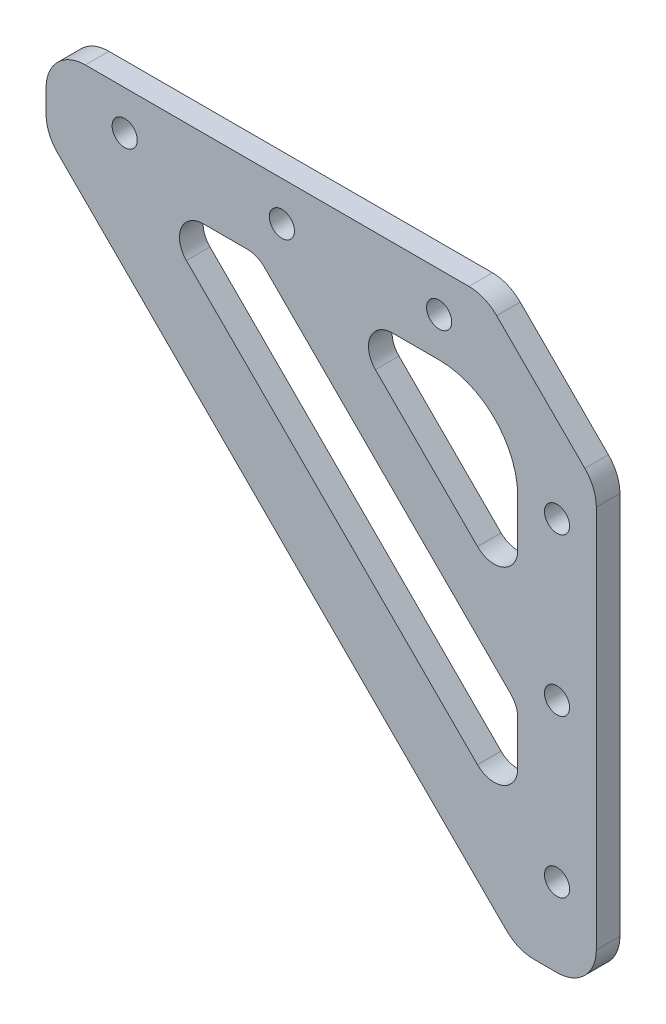
ISO-10303-21;
HEADER;
FILE_DESCRIPTION(('STEP AP214'),'2;1');
FILE_NAME('part.step','',(''),(''),'','','');
FILE_SCHEMA(('AUTOMOTIVE_DESIGN { 1 0 10303 214 1 1 1 1 }'));
ENDSEC;
DATA;
#1=APPLICATION_CONTEXT('core data for automotive mechanical design processes');
#2=APPLICATION_PROTOCOL_DEFINITION('international standard','automotive_design',2000,#1);
#3=PRODUCT_CONTEXT('',#1,'mechanical');
#4=PRODUCT('Part','Part','',(#3));
#5=PRODUCT_RELATED_PRODUCT_CATEGORY('part','',(#4));
#6=PRODUCT_DEFINITION_FORMATION('','',#4);
#7=PRODUCT_DEFINITION_CONTEXT('part definition',#1,'design');
#8=PRODUCT_DEFINITION('design','',#6,#7);
#9=PRODUCT_DEFINITION_SHAPE('','',#8);
#10=(LENGTH_UNIT() NAMED_UNIT(*) SI_UNIT(.MILLI.,.METRE.));
#11=(NAMED_UNIT(*) PLANE_ANGLE_UNIT() SI_UNIT($,.RADIAN.));
#12=(NAMED_UNIT(*) SI_UNIT($,.STERADIAN.) SOLID_ANGLE_UNIT());
#13=UNCERTAINTY_MEASURE_WITH_UNIT(LENGTH_MEASURE(1.E-05),#10,'distance_accuracy_value','');
#14=(GEOMETRIC_REPRESENTATION_CONTEXT(3) GLOBAL_UNCERTAINTY_ASSIGNED_CONTEXT((#13)) GLOBAL_UNIT_ASSIGNED_CONTEXT((#10,
#11,#12)) REPRESENTATION_CONTEXT('',''));
#15=CARTESIAN_POINT('',(0.,0.,0.));
#16=DIRECTION('',(0.,0.,1.));
#17=DIRECTION('',(1.,0.,0.));
#18=AXIS2_PLACEMENT_3D('',#15,#16,#17);
#19=CARTESIAN_POINT('',(-70.,-10.,3.));
#20=DIRECTION('',(0.,1.,0.));
#21=DIRECTION('',(-1.,0.,0.));
#22=AXIS2_PLACEMENT_3D('',#19,#20,#21);
#23=PLANE('',#22);
#24=DIRECTION('',(1.,0.,0.));
#25=VECTOR('',#24,1.);
#26=CARTESIAN_POINT('',(-70.,-10.,0.));
#27=LINE('',#26,#25);
#28=CARTESIAN_POINT('',(-25.9878066911802,-10.,0.));
#29=VERTEX_POINT('',#28);
#30=CARTESIAN_POINT('',(-20.,-10.,0.));
#31=VERTEX_POINT('',#30);
#32=EDGE_CURVE('E461',#29,#31,#27,.T.);
#33=ORIENTED_EDGE('',*,*,#32,.T.);
#34=DIRECTION('',(0.,0.,-1.));
#35=VECTOR('',#34,1.);
#36=CARTESIAN_POINT('',(-20.,-10.,3.));
#37=LINE('',#36,#35);
#38=CARTESIAN_POINT('',(-20.,-10.,3.));
#39=VERTEX_POINT('',#38);
#40=EDGE_CURVE('E64',#31,#39,#37,.F.);
#41=ORIENTED_EDGE('',*,*,#40,.T.);
#42=DIRECTION('',(1.,0.,0.));
#43=VECTOR('',#42,1.);
#44=CARTESIAN_POINT('',(-70.,-10.,3.));
#45=LINE('',#44,#43);
#46=CARTESIAN_POINT('',(-25.9878066911802,-10.,3.));
#47=VERTEX_POINT('',#46);
#48=EDGE_CURVE('E448',#47,#39,#45,.T.);
#49=ORIENTED_EDGE('',*,*,#48,.F.);
#50=DIRECTION('',(0.,0.,1.));
#51=VECTOR('',#50,1.);
#52=CARTESIAN_POINT('',(-25.9878066911802,-10.,3.));
#53=LINE('',#52,#51);
#54=EDGE_CURVE('E319',#47,#29,#53,.F.);
#55=ORIENTED_EDGE('',*,*,#54,.T.);
#56=EDGE_LOOP('',(#33,#41,#49,#55));
#57=FACE_BOUND('',#56,.T.);
#58=ADVANCED_FACE('F43',(#57),#23,.F.);
#59=CARTESIAN_POINT('',(-9.99999999999999,-70.,3.));
#60=DIRECTION('',(1.,0.,0.));
#61=DIRECTION('',(0.,1.,0.));
#62=AXIS2_PLACEMENT_3D('',#59,#60,#61);
#63=PLANE('',#62);
#64=DIRECTION('',(0.,-1.,0.));
#65=VECTOR('',#64,1.);
#66=CARTESIAN_POINT('',(-9.99999999999999,-70.,3.));
#67=LINE('',#66,#65);
#68=CARTESIAN_POINT('',(-9.99999999999999,-20.,3.));
#69=VERTEX_POINT('',#68);
#70=CARTESIAN_POINT('',(-9.99999999999999,-25.9878066911802,3.));
#71=VERTEX_POINT('',#70);
#72=EDGE_CURVE('E358',#69,#71,#67,.T.);
#73=ORIENTED_EDGE('',*,*,#72,.F.);
#74=DIRECTION('',(0.,0.,-1.));
#75=VECTOR('',#74,1.);
#76=CARTESIAN_POINT('',(-9.99999999999999,-20.,0.));
#77=LINE('',#76,#75);
#78=CARTESIAN_POINT('',(-9.99999999999999,-20.,0.));
#79=VERTEX_POINT('',#78);
#80=EDGE_CURVE('E351',#69,#79,#77,.T.);
#81=ORIENTED_EDGE('',*,*,#80,.T.);
#82=DIRECTION('',(0.,-1.,0.));
#83=VECTOR('',#82,1.);
#84=CARTESIAN_POINT('',(-9.99999999999999,-70.,0.));
#85=LINE('',#84,#83);
#86=CARTESIAN_POINT('',(-9.99999999999999,-25.9878066911802,0.));
#87=VERTEX_POINT('',#86);
#88=EDGE_CURVE('E243',#79,#87,#85,.T.);
#89=ORIENTED_EDGE('',*,*,#88,.T.);
#90=DIRECTION('',(0.,0.,1.));
#91=VECTOR('',#90,1.);
#92=CARTESIAN_POINT('',(-9.99999999999999,-25.9878066911802,3.));
#93=LINE('',#92,#91);
#94=EDGE_CURVE('E311',#87,#71,#93,.T.);
#95=ORIENTED_EDGE('',*,*,#94,.T.);
#96=EDGE_LOOP('',(#73,#81,#89,#95));
#97=FACE_BOUND('',#96,.T.);
#98=ADVANCED_FACE('F357',(#97),#63,.F.);
#99=CARTESIAN_POINT('',(0.,0.,3.));
#100=DIRECTION('',(-1.,0.,0.));
#101=DIRECTION('',(0.,-1.,0.));
#102=AXIS2_PLACEMENT_3D('',#99,#100,#101);
#103=PLANE('',#102);
#104=DIRECTION('',(0.,1.,0.));
#105=VECTOR('',#104,1.);
#106=CARTESIAN_POINT('',(0.,0.,3.));
#107=LINE('',#106,#105);
#108=CARTESIAN_POINT('',(0.,-65.,3.));
#109=VERTEX_POINT('',#108);
#110=CARTESIAN_POINT('',(0.,-16.2132034355964,3.));
#111=VERTEX_POINT('',#110);
#112=EDGE_CURVE('E242',#109,#111,#107,.T.);
#113=ORIENTED_EDGE('',*,*,#112,.F.);
#114=DIRECTION('',(0.,0.,-1.));
#115=VECTOR('',#114,1.);
#116=CARTESIAN_POINT('',(0.,-65.,3.));
#117=LINE('',#116,#115);
#118=CARTESIAN_POINT('',(0.,-65.,0.));
#119=VERTEX_POINT('',#118);
#120=EDGE_CURVE('E278',#109,#119,#117,.T.);
#121=ORIENTED_EDGE('',*,*,#120,.T.);
#122=DIRECTION('',(0.,1.,0.));
#123=VECTOR('',#122,1.);
#124=CARTESIAN_POINT('',(0.,0.,0.));
#125=LINE('',#124,#123);
#126=CARTESIAN_POINT('',(0.,-16.2132034355964,0.));
#127=VERTEX_POINT('',#126);
#128=EDGE_CURVE('E440',#119,#127,#125,.T.);
#129=ORIENTED_EDGE('',*,*,#128,.T.);
#130=DIRECTION('',(0.,0.,-1.));
#131=VECTOR('',#130,1.);
#132=CARTESIAN_POINT('',(0.,-16.2132034355964,3.));
#133=LINE('',#132,#131);
#134=EDGE_CURVE('E276',#127,#111,#133,.F.);
#135=ORIENTED_EDGE('',*,*,#134,.T.);
#136=EDGE_LOOP('',(#113,#121,#129,#135));
#137=FACE_BOUND('',#136,.T.);
#138=ADVANCED_FACE('F516',(#137),#103,.F.);
#139=CARTESIAN_POINT('',(0.,0.,3.));
#140=DIRECTION('',(0.,0.,-1.));
#141=DIRECTION('',(-1.,0.,0.));
#142=AXIS2_PLACEMENT_3D('',#139,#140,#141);
#143=PLANE('',#142);
#144=DIRECTION('',(-0.707106781186548,0.707106781186547,0.));
#145=VECTOR('',#144,1.);
#146=CARTESIAN_POINT('',(-9.99999999999999,-57.2720779386421,3.));
#147=LINE('',#146,#145);
#148=CARTESIAN_POINT('',(-15.1213203435596,-52.1507575950825,3.));
#149=VERTEX_POINT('',#148);
#150=CARTESIAN_POINT('',(-52.1507575950825,-15.1213203435596,3.));
#151=VERTEX_POINT('',#150);
#152=EDGE_CURVE('E399',#149,#151,#147,.T.);
#153=ORIENTED_EDGE('',*,*,#152,.T.);
#154=CARTESIAN_POINT('',(-50.0294372515229,-13.,3.));
#155=DIRECTION('',(0.,0.,-1.));
#156=DIRECTION('',(-1.,0.,0.));
#157=AXIS2_PLACEMENT_3D('',#154,#155,#156);
#158=CIRCLE('',#157,3.);
#159=CARTESIAN_POINT('',(-50.0294372515229,-10.,3.));
#160=VERTEX_POINT('',#159);
#161=EDGE_CURVE('E347',#151,#160,#158,.T.);
#162=ORIENTED_EDGE('',*,*,#161,.T.);
#163=CARTESIAN_POINT('',(-44.3725830020305,-10.,3.));
#164=VERTEX_POINT('',#163);
#165=EDGE_CURVE('E450',#160,#164,#45,.T.);
#166=ORIENTED_EDGE('',*,*,#165,.T.);
#167=CARTESIAN_POINT('',(-44.3725830020305,-13.,3.));
#168=DIRECTION('',(0.,0.,-1.));
#169=DIRECTION('',(-1.,0.,0.));
#170=AXIS2_PLACEMENT_3D('',#167,#168,#169);
#171=CIRCLE('',#170,3.);
#172=CARTESIAN_POINT('',(-42.2512626584708,-10.8786796564404,3.));
#173=VERTEX_POINT('',#172);
#174=EDGE_CURVE('E330',#164,#173,#171,.T.);
#175=ORIENTED_EDGE('',*,*,#174,.T.);
#176=DIRECTION('',(0.707106781186548,-0.707106781186548,0.));
#177=VECTOR('',#176,1.);
#178=CARTESIAN_POINT('',(-43.1299423149112,-10.,3.));
#179=LINE('',#178,#177);
#180=CARTESIAN_POINT('',(-10.8786796564403,-42.2512626584708,3.));
#181=VERTEX_POINT('',#180);
#182=EDGE_CURVE('E381',#173,#181,#179,.T.);
#183=ORIENTED_EDGE('',*,*,#182,.T.);
#184=CARTESIAN_POINT('',(-13.,-44.3725830020305,3.));
#185=DIRECTION('',(0.,0.,-1.));
#186=DIRECTION('',(-1.,0.,0.));
#187=AXIS2_PLACEMENT_3D('',#184,#185,#186);
#188=CIRCLE('',#187,3.);
#189=CARTESIAN_POINT('',(-9.99999999999999,-44.3725830020305,3.));
#190=VERTEX_POINT('',#189);
#191=EDGE_CURVE('E326',#181,#190,#188,.T.);
#192=ORIENTED_EDGE('',*,*,#191,.T.);
#193=CARTESIAN_POINT('',(-9.99999999999999,-50.0294372515229,3.));
#194=VERTEX_POINT('',#193);
#195=EDGE_CURVE('E452',#190,#194,#67,.T.);
#196=ORIENTED_EDGE('',*,*,#195,.T.);
#197=CARTESIAN_POINT('',(-13.,-50.0294372515229,3.));
#198=DIRECTION('',(0.,0.,-1.));
#199=DIRECTION('',(-1.,0.,0.));
#200=AXIS2_PLACEMENT_3D('',#197,#198,#199);
#201=CIRCLE('',#200,3.);
#202=EDGE_CURVE('E343',#194,#149,#201,.T.);
#203=ORIENTED_EDGE('',*,*,#202,.T.);
#204=EDGE_LOOP('',(#153,#162,#166,#175,#183,#192,#196,#203));
#205=FACE_BOUND('',#204,.T.);
#206=ORIENTED_EDGE('',*,*,#48,.T.);
#207=CARTESIAN_POINT('',(-20.,-20.,3.));
#208=DIRECTION('',(0.,0.,-1.));
#209=DIRECTION('',(-1.,0.,0.));
#210=AXIS2_PLACEMENT_3D('',#207,#208,#209);
#211=CIRCLE('',#210,10.);
#212=EDGE_CURVE('E11',#39,#69,#211,.T.);
#213=ORIENTED_EDGE('',*,*,#212,.T.);
#214=ORIENTED_EDGE('',*,*,#72,.T.);
#215=CARTESIAN_POINT('',(-13.,-25.9878066911802,3.));
#216=DIRECTION('',(0.,0.,-1.));
#217=DIRECTION('',(-1.,0.,0.));
#218=AXIS2_PLACEMENT_3D('',#215,#216,#217);
#219=CIRCLE('',#218,3.);
#220=CARTESIAN_POINT('',(-15.1213203435596,-28.1091270347399,3.));
#221=VERTEX_POINT('',#220);
#222=EDGE_CURVE('E334',#71,#221,#219,.T.);
#223=ORIENTED_EDGE('',*,*,#222,.T.);
#224=DIRECTION('',(-0.707106781186548,0.707106781186548,0.));
#225=VECTOR('',#224,1.);
#226=CARTESIAN_POINT('',(-9.99999999999999,-33.2304473782995,3.));
#227=LINE('',#226,#225);
#228=CARTESIAN_POINT('',(-28.1091270347399,-15.1213203435596,3.));
#229=VERTEX_POINT('',#228);
#230=EDGE_CURVE('E376',#221,#229,#227,.T.);
#231=ORIENTED_EDGE('',*,*,#230,.T.);
#232=CARTESIAN_POINT('',(-25.9878066911802,-13.,3.));
#233=DIRECTION('',(0.,0.,-1.));
#234=DIRECTION('',(-1.,0.,0.));
#235=AXIS2_PLACEMENT_3D('',#232,#233,#234);
#236=CIRCLE('',#235,3.);
#237=EDGE_CURVE('E339',#229,#47,#236,.T.);
#238=ORIENTED_EDGE('',*,*,#237,.T.);
#239=EDGE_LOOP('',(#206,#213,#214,#223,#231,#238));
#240=FACE_BOUND('',#239,.T.);
#241=DIRECTION('',(0.707106781186548,-0.707106781186547,0.));
#242=VECTOR('',#241,1.);
#243=CARTESIAN_POINT('',(-70.,-10.,3.));
#244=LINE('',#243,#242);
#245=CARTESIAN_POINT('',(-68.5355339059327,-11.4644660940673,3.));
#246=VERTEX_POINT('',#245);
#247=CARTESIAN_POINT('',(-11.4644660940673,-68.5355339059327,3.));
#248=VERTEX_POINT('',#247);
#249=EDGE_CURVE('E392',#246,#248,#244,.T.);
#250=ORIENTED_EDGE('',*,*,#249,.T.);
#251=CARTESIAN_POINT('',(-7.92893218813453,-65.,3.));
#252=DIRECTION('',(0.,0.,-1.));
#253=DIRECTION('',(-1.,0.,0.));
#254=AXIS2_PLACEMENT_3D('',#251,#252,#253);
#255=CIRCLE('',#254,5.);
#256=CARTESIAN_POINT('',(-7.92893218813452,-70.,3.));
#257=VERTEX_POINT('',#256);
#258=EDGE_CURVE('E274',#248,#257,#255,.F.);
#259=ORIENTED_EDGE('',*,*,#258,.T.);
#260=DIRECTION('',(1.,0.,0.));
#261=VECTOR('',#260,1.);
#262=CARTESIAN_POINT('',(0.,-70.,3.));
#263=LINE('',#262,#261);
#264=CARTESIAN_POINT('',(-4.99999999999995,-70.,3.));
#265=VERTEX_POINT('',#264);
#266=EDGE_CURVE('E236',#257,#265,#263,.T.);
#267=ORIENTED_EDGE('',*,*,#266,.T.);
#268=CARTESIAN_POINT('',(-4.99999999999996,-65.,3.));
#269=DIRECTION('',(0.,0.,-1.));
#270=DIRECTION('',(-1.,0.,0.));
#271=AXIS2_PLACEMENT_3D('',#268,#269,#270);
#272=CIRCLE('',#271,5.);
#273=EDGE_CURVE('E272',#265,#109,#272,.F.);
#274=ORIENTED_EDGE('',*,*,#273,.T.);
#275=ORIENTED_EDGE('',*,*,#112,.T.);
#276=CARTESIAN_POINT('',(-4.99999999999999,-16.2132034355964,3.));
#277=DIRECTION('',(0.,0.,-1.));
#278=DIRECTION('',(-1.,0.,0.));
#279=AXIS2_PLACEMENT_3D('',#276,#277,#278);
#280=CIRCLE('',#279,5.);
#281=CARTESIAN_POINT('',(-1.46446609406726,-12.6776695296637,3.));
#282=VERTEX_POINT('',#281);
#283=EDGE_CURVE('E266',#111,#282,#280,.F.);
#284=ORIENTED_EDGE('',*,*,#283,.T.);
#285=DIRECTION('',(-0.707106781186548,0.707106781186547,0.));
#286=VECTOR('',#285,1.);
#287=CARTESIAN_POINT('',(-14.142135623731,0.,3.));
#288=LINE('',#287,#286);
#289=CARTESIAN_POINT('',(-12.6776695296637,-1.46446609406725,3.));
#290=VERTEX_POINT('',#289);
#291=EDGE_CURVE('E393',#282,#290,#288,.T.);
#292=ORIENTED_EDGE('',*,*,#291,.T.);
#293=CARTESIAN_POINT('',(-16.2132034355964,-4.99999999999999,3.));
#294=DIRECTION('',(0.,0.,-1.));
#295=DIRECTION('',(-1.,0.,0.));
#296=AXIS2_PLACEMENT_3D('',#293,#294,#295);
#297=CIRCLE('',#296,5.);
#298=CARTESIAN_POINT('',(-16.2132034355964,0.,3.));
#299=VERTEX_POINT('',#298);
#300=EDGE_CURVE('E264',#290,#299,#297,.F.);
#301=ORIENTED_EDGE('',*,*,#300,.T.);
#302=DIRECTION('',(-1.,0.,0.));
#303=VECTOR('',#302,1.);
#304=CARTESIAN_POINT('',(0.,0.,3.));
#305=LINE('',#304,#303);
#306=CARTESIAN_POINT('',(-65.,0.,3.));
#307=VERTEX_POINT('',#306);
#308=EDGE_CURVE('E246',#299,#307,#305,.T.);
#309=ORIENTED_EDGE('',*,*,#308,.T.);
#310=CARTESIAN_POINT('',(-65.,-4.99999999999997,3.));
#311=DIRECTION('',(0.,0.,-1.));
#312=DIRECTION('',(-1.,0.,0.));
#313=AXIS2_PLACEMENT_3D('',#310,#311,#312);
#314=CIRCLE('',#313,5.);
#315=CARTESIAN_POINT('',(-70.,-4.99999999999997,3.));
#316=VERTEX_POINT('',#315);
#317=EDGE_CURVE('E268',#307,#316,#314,.F.);
#318=ORIENTED_EDGE('',*,*,#317,.T.);
#319=DIRECTION('',(0.,-1.,0.));
#320=VECTOR('',#319,1.);
#321=CARTESIAN_POINT('',(-70.,0.,3.));
#322=LINE('',#321,#320);
#323=CARTESIAN_POINT('',(-70.,-7.92893218813453,3.));
#324=VERTEX_POINT('',#323);
#325=EDGE_CURVE('E445',#316,#324,#322,.T.);
#326=ORIENTED_EDGE('',*,*,#325,.T.);
#327=CARTESIAN_POINT('',(-65.,-7.92893218813453,3.));
#328=DIRECTION('',(0.,0.,-1.));
#329=DIRECTION('',(-1.,0.,0.));
#330=AXIS2_PLACEMENT_3D('',#327,#328,#329);
#331=CIRCLE('',#330,5.);
#332=EDGE_CURVE('E270',#324,#246,#331,.F.);
#333=ORIENTED_EDGE('',*,*,#332,.T.);
#334=EDGE_LOOP('',(#250,#259,#267,#274,#275,#284,#292,#301,#309,#318,#326,#333));
#335=FACE_BOUND('',#334,.T.);
#336=CARTESIAN_POINT('',(-40.,-5.00000000000001,3.));
#337=DIRECTION('',(0.,0.,1.));
#338=DIRECTION('',(1.,0.,0.));
#339=AXIS2_PLACEMENT_3D('',#336,#337,#338);
#340=CIRCLE('',#339,1.6);
#341=CARTESIAN_POINT('',(-38.4,-5.00000000000001,3.));
#342=VERTEX_POINT('',#341);
#343=EDGE_CURVE('E437',#342,#342,#340,.T.);
#344=ORIENTED_EDGE('',*,*,#343,.F.);
#345=EDGE_LOOP('',(#344));
#346=FACE_BOUND('',#345,.T.);
#347=CARTESIAN_POINT('',(-20.,-5.00000000000001,3.));
#348=DIRECTION('',(0.,0.,1.));
#349=DIRECTION('',(1.,0.,0.));
#350=AXIS2_PLACEMENT_3D('',#347,#348,#349);
#351=CIRCLE('',#350,1.6);
#352=CARTESIAN_POINT('',(-18.4,-5.00000000000001,3.));
#353=VERTEX_POINT('',#352);
#354=EDGE_CURVE('E431',#353,#353,#351,.T.);
#355=ORIENTED_EDGE('',*,*,#354,.F.);
#356=EDGE_LOOP('',(#355));
#357=FACE_BOUND('',#356,.T.);
#358=CARTESIAN_POINT('',(-5.,-20.,3.));
#359=DIRECTION('',(0.,0.,1.));
#360=DIRECTION('',(-1.,0.,0.));
#361=AXIS2_PLACEMENT_3D('',#358,#359,#360);
#362=CIRCLE('',#361,1.6);
#363=CARTESIAN_POINT('',(-6.6,-20.,3.));
#364=VERTEX_POINT('',#363);
#365=EDGE_CURVE('E425',#364,#364,#362,.T.);
#366=ORIENTED_EDGE('',*,*,#365,.F.);
#367=EDGE_LOOP('',(#366));
#368=FACE_BOUND('',#367,.T.);
#369=CARTESIAN_POINT('',(-5.,-60.,3.));
#370=DIRECTION('',(0.,0.,1.));
#371=DIRECTION('',(-1.,0.,0.));
#372=AXIS2_PLACEMENT_3D('',#369,#370,#371);
#373=CIRCLE('',#372,1.6);
#374=CARTESIAN_POINT('',(-6.6,-60.,3.));
#375=VERTEX_POINT('',#374);
#376=EDGE_CURVE('E419',#375,#375,#373,.T.);
#377=ORIENTED_EDGE('',*,*,#376,.F.);
#378=EDGE_LOOP('',(#377));
#379=FACE_BOUND('',#378,.T.);
#380=CARTESIAN_POINT('',(-60.,-5.00000000000001,3.));
#381=DIRECTION('',(0.,0.,1.));
#382=DIRECTION('',(1.,0.,0.));
#383=AXIS2_PLACEMENT_3D('',#380,#381,#382);
#384=CIRCLE('',#383,1.6);
#385=CARTESIAN_POINT('',(-58.4,-5.00000000000001,3.));
#386=VERTEX_POINT('',#385);
#387=EDGE_CURVE('E413',#386,#386,#384,.T.);
#388=ORIENTED_EDGE('',*,*,#387,.F.);
#389=EDGE_LOOP('',(#388));
#390=FACE_BOUND('',#389,.T.);
#391=CARTESIAN_POINT('',(-5.,-40.,3.));
#392=DIRECTION('',(0.,0.,1.));
#393=DIRECTION('',(-1.,0.,0.));
#394=AXIS2_PLACEMENT_3D('',#391,#392,#393);
#395=CIRCLE('',#394,1.6);
#396=CARTESIAN_POINT('',(-6.6,-40.,3.));
#397=VERTEX_POINT('',#396);
#398=EDGE_CURVE('E407',#397,#397,#395,.T.);
#399=ORIENTED_EDGE('',*,*,#398,.F.);
#400=EDGE_LOOP('',(#399));
#401=FACE_BOUND('',#400,.T.);
#402=ADVANCED_FACE('F374',(#205,#240,#335,#346,#357,#368,#379,#390,#401),#143,.F.);
#403=CARTESIAN_POINT('',(0.,0.,0.));
#404=DIRECTION('',(0.,0.,-1.));
#405=DIRECTION('',(-1.,0.,0.));
#406=AXIS2_PLACEMENT_3D('',#403,#404,#405);
#407=PLANE('',#406);
#408=DIRECTION('',(0.707106781186548,-0.707106781186548,0.));
#409=VECTOR('',#408,1.);
#410=CARTESIAN_POINT('',(-43.1299423149112,-10.,0.));
#411=LINE('',#410,#409);
#412=CARTESIAN_POINT('',(-42.2512626584708,-10.8786796564404,0.));
#413=VERTEX_POINT('',#412);
#414=CARTESIAN_POINT('',(-10.8786796564403,-42.2512626584708,0.));
#415=VERTEX_POINT('',#414);
#416=EDGE_CURVE('E380',#413,#415,#411,.T.);
#417=ORIENTED_EDGE('',*,*,#416,.F.);
#418=CARTESIAN_POINT('',(-44.3725830020305,-13.,0.));
#419=DIRECTION('',(0.,0.,-1.));
#420=DIRECTION('',(-1.,0.,0.));
#421=AXIS2_PLACEMENT_3D('',#418,#419,#420);
#422=CIRCLE('',#421,3.);
#423=CARTESIAN_POINT('',(-44.3725830020305,-10.,0.));
#424=VERTEX_POINT('',#423);
#425=EDGE_CURVE('E332',#413,#424,#422,.F.);
#426=ORIENTED_EDGE('',*,*,#425,.T.);
#427=CARTESIAN_POINT('',(-50.0294372515229,-10.,0.));
#428=VERTEX_POINT('',#427);
#429=EDGE_CURVE('E462',#428,#424,#27,.T.);
#430=ORIENTED_EDGE('',*,*,#429,.F.);
#431=CARTESIAN_POINT('',(-50.0294372515229,-13.,0.));
#432=DIRECTION('',(0.,0.,-1.));
#433=DIRECTION('',(-1.,0.,0.));
#434=AXIS2_PLACEMENT_3D('',#431,#432,#433);
#435=CIRCLE('',#434,3.);
#436=CARTESIAN_POINT('',(-52.1507575950825,-15.1213203435596,0.));
#437=VERTEX_POINT('',#436);
#438=EDGE_CURVE('E349',#428,#437,#435,.F.);
#439=ORIENTED_EDGE('',*,*,#438,.T.);
#440=DIRECTION('',(-0.707106781186548,0.707106781186547,0.));
#441=VECTOR('',#440,1.);
#442=CARTESIAN_POINT('',(-9.99999999999999,-57.2720779386421,0.));
#443=LINE('',#442,#441);
#444=CARTESIAN_POINT('',(-15.1213203435596,-52.1507575950825,0.));
#445=VERTEX_POINT('',#444);
#446=EDGE_CURVE('E398',#445,#437,#443,.T.);
#447=ORIENTED_EDGE('',*,*,#446,.F.);
#448=CARTESIAN_POINT('',(-13.,-50.0294372515229,0.));
#449=DIRECTION('',(0.,0.,-1.));
#450=DIRECTION('',(-1.,0.,0.));
#451=AXIS2_PLACEMENT_3D('',#448,#449,#450);
#452=CIRCLE('',#451,3.);
#453=CARTESIAN_POINT('',(-9.99999999999999,-50.0294372515229,0.));
#454=VERTEX_POINT('',#453);
#455=EDGE_CURVE('E345',#445,#454,#452,.F.);
#456=ORIENTED_EDGE('',*,*,#455,.T.);
#457=CARTESIAN_POINT('',(-9.99999999999999,-44.3725830020305,0.));
#458=VERTEX_POINT('',#457);
#459=EDGE_CURVE('E248',#458,#454,#85,.T.);
#460=ORIENTED_EDGE('',*,*,#459,.F.);
#461=CARTESIAN_POINT('',(-13.,-44.3725830020305,0.));
#462=DIRECTION('',(0.,0.,-1.));
#463=DIRECTION('',(-1.,0.,0.));
#464=AXIS2_PLACEMENT_3D('',#461,#462,#463);
#465=CIRCLE('',#464,3.);
#466=EDGE_CURVE('E328',#458,#415,#465,.F.);
#467=ORIENTED_EDGE('',*,*,#466,.T.);
#468=EDGE_LOOP('',(#417,#426,#430,#439,#447,#456,#460,#467));
#469=FACE_BOUND('',#468,.T.);
#470=DIRECTION('',(1.,0.,0.));
#471=VECTOR('',#470,1.);
#472=CARTESIAN_POINT('',(0.,-70.,0.));
#473=LINE('',#472,#471);
#474=CARTESIAN_POINT('',(-7.92893218813452,-70.,0.));
#475=VERTEX_POINT('',#474);
#476=CARTESIAN_POINT('',(-4.99999999999995,-70.,0.));
#477=VERTEX_POINT('',#476);
#478=EDGE_CURVE('E233',#475,#477,#473,.T.);
#479=ORIENTED_EDGE('',*,*,#478,.F.);
#480=CARTESIAN_POINT('',(-7.92893218813453,-65.,0.));
#481=DIRECTION('',(0.,0.,-1.));
#482=DIRECTION('',(-1.,0.,0.));
#483=AXIS2_PLACEMENT_3D('',#480,#481,#482);
#484=CIRCLE('',#483,5.);
#485=CARTESIAN_POINT('',(-11.4644660940673,-68.5355339059327,0.));
#486=VERTEX_POINT('',#485);
#487=EDGE_CURVE('E216',#475,#486,#484,.T.);
#488=ORIENTED_EDGE('',*,*,#487,.T.);
#489=DIRECTION('',(0.707106781186548,-0.707106781186547,0.));
#490=VECTOR('',#489,1.);
#491=CARTESIAN_POINT('',(-70.,-10.,0.));
#492=LINE('',#491,#490);
#493=CARTESIAN_POINT('',(-68.5355339059327,-11.4644660940673,0.));
#494=VERTEX_POINT('',#493);
#495=EDGE_CURVE('E396',#494,#486,#492,.T.);
#496=ORIENTED_EDGE('',*,*,#495,.F.);
#497=CARTESIAN_POINT('',(-65.,-7.92893218813453,0.));
#498=DIRECTION('',(0.,0.,-1.));
#499=DIRECTION('',(-1.,0.,0.));
#500=AXIS2_PLACEMENT_3D('',#497,#498,#499);
#501=CIRCLE('',#500,5.);
#502=CARTESIAN_POINT('',(-70.,-7.92893218813453,0.));
#503=VERTEX_POINT('',#502);
#504=EDGE_CURVE('E258',#494,#503,#501,.T.);
#505=ORIENTED_EDGE('',*,*,#504,.T.);
#506=DIRECTION('',(0.,-1.,0.));
#507=VECTOR('',#506,1.);
#508=CARTESIAN_POINT('',(-70.,0.,0.));
#509=LINE('',#508,#507);
#510=CARTESIAN_POINT('',(-70.,-4.99999999999997,0.));
#511=VERTEX_POINT('',#510);
#512=EDGE_CURVE('E459',#511,#503,#509,.T.);
#513=ORIENTED_EDGE('',*,*,#512,.F.);
#514=CARTESIAN_POINT('',(-65.,-4.99999999999997,0.));
#515=DIRECTION('',(0.,0.,-1.));
#516=DIRECTION('',(-1.,0.,0.));
#517=AXIS2_PLACEMENT_3D('',#514,#515,#516);
#518=CIRCLE('',#517,5.);
#519=CARTESIAN_POINT('',(-65.,0.,0.));
#520=VERTEX_POINT('',#519);
#521=EDGE_CURVE('E256',#511,#520,#518,.T.);
#522=ORIENTED_EDGE('',*,*,#521,.T.);
#523=DIRECTION('',(-1.,0.,0.));
#524=VECTOR('',#523,1.);
#525=CARTESIAN_POINT('',(0.,0.,0.));
#526=LINE('',#525,#524);
#527=CARTESIAN_POINT('',(-16.2132034355964,0.,0.));
#528=VERTEX_POINT('',#527);
#529=EDGE_CURVE('E456',#528,#520,#526,.T.);
#530=ORIENTED_EDGE('',*,*,#529,.F.);
#531=CARTESIAN_POINT('',(-16.2132034355964,-4.99999999999999,0.));
#532=DIRECTION('',(0.,0.,-1.));
#533=DIRECTION('',(-1.,0.,0.));
#534=AXIS2_PLACEMENT_3D('',#531,#532,#533);
#535=CIRCLE('',#534,5.);
#536=CARTESIAN_POINT('',(-12.6776695296637,-1.46446609406725,0.));
#537=VERTEX_POINT('',#536);
#538=EDGE_CURVE('E237',#528,#537,#535,.T.);
#539=ORIENTED_EDGE('',*,*,#538,.T.);
#540=DIRECTION('',(-0.707106781186548,0.707106781186547,0.));
#541=VECTOR('',#540,1.);
#542=CARTESIAN_POINT('',(-14.142135623731,0.,0.));
#543=LINE('',#542,#541);
#544=CARTESIAN_POINT('',(-1.46446609406726,-12.6776695296637,0.));
#545=VERTEX_POINT('',#544);
#546=EDGE_CURVE('E389',#545,#537,#543,.T.);
#547=ORIENTED_EDGE('',*,*,#546,.F.);
#548=CARTESIAN_POINT('',(-4.99999999999999,-16.2132034355964,0.));
#549=DIRECTION('',(0.,0.,-1.));
#550=DIRECTION('',(-1.,0.,0.));
#551=AXIS2_PLACEMENT_3D('',#548,#549,#550);
#552=CIRCLE('',#551,5.);
#553=EDGE_CURVE('E254',#545,#127,#552,.T.);
#554=ORIENTED_EDGE('',*,*,#553,.T.);
#555=ORIENTED_EDGE('',*,*,#128,.F.);
#556=CARTESIAN_POINT('',(-4.99999999999996,-65.,0.));
#557=DIRECTION('',(0.,0.,-1.));
#558=DIRECTION('',(-1.,0.,0.));
#559=AXIS2_PLACEMENT_3D('',#556,#557,#558);
#560=CIRCLE('',#559,5.);
#561=EDGE_CURVE('E227',#119,#477,#560,.T.);
#562=ORIENTED_EDGE('',*,*,#561,.T.);
#563=EDGE_LOOP('',(#479,#488,#496,#505,#513,#522,#530,#539,#547,#554,#555,#562));
#564=FACE_BOUND('',#563,.T.);
#565=ORIENTED_EDGE('',*,*,#32,.F.);
#566=CARTESIAN_POINT('',(-25.9878066911802,-13.,0.));
#567=DIRECTION('',(0.,0.,-1.));
#568=DIRECTION('',(-1.,0.,0.));
#569=AXIS2_PLACEMENT_3D('',#566,#567,#568);
#570=CIRCLE('',#569,3.);
#571=CARTESIAN_POINT('',(-28.1091270347399,-15.1213203435596,0.));
#572=VERTEX_POINT('',#571);
#573=EDGE_CURVE('E341',#29,#572,#570,.F.);
#574=ORIENTED_EDGE('',*,*,#573,.T.);
#575=DIRECTION('',(-0.707106781186548,0.707106781186548,0.));
#576=VECTOR('',#575,1.);
#577=CARTESIAN_POINT('',(-9.99999999999999,-33.2304473782995,0.));
#578=LINE('',#577,#576);
#579=CARTESIAN_POINT('',(-15.1213203435596,-28.1091270347399,0.));
#580=VERTEX_POINT('',#579);
#581=EDGE_CURVE('E366',#580,#572,#578,.T.);
#582=ORIENTED_EDGE('',*,*,#581,.F.);
#583=CARTESIAN_POINT('',(-13.,-25.9878066911802,0.));
#584=DIRECTION('',(0.,0.,-1.));
#585=DIRECTION('',(-1.,0.,0.));
#586=AXIS2_PLACEMENT_3D('',#583,#584,#585);
#587=CIRCLE('',#586,3.);
#588=EDGE_CURVE('E336',#580,#87,#587,.F.);
#589=ORIENTED_EDGE('',*,*,#588,.T.);
#590=ORIENTED_EDGE('',*,*,#88,.F.);
#591=CARTESIAN_POINT('',(-20.,-20.,0.));
#592=DIRECTION('',(0.,0.,-1.));
#593=DIRECTION('',(-1.,0.,0.));
#594=AXIS2_PLACEMENT_3D('',#591,#592,#593);
#595=CIRCLE('',#594,10.);
#596=EDGE_CURVE('E51',#79,#31,#595,.F.);
#597=ORIENTED_EDGE('',*,*,#596,.T.);
#598=EDGE_LOOP('',(#565,#574,#582,#589,#590,#597));
#599=FACE_BOUND('',#598,.T.);
#600=CARTESIAN_POINT('',(-60.,-5.00000000000001,0.));
#601=DIRECTION('',(0.,0.,1.));
#602=DIRECTION('',(1.,0.,0.));
#603=AXIS2_PLACEMENT_3D('',#600,#601,#602);
#604=CIRCLE('',#603,1.6);
#605=CARTESIAN_POINT('',(-58.4,-5.00000000000001,0.));
#606=VERTEX_POINT('',#605);
#607=EDGE_CURVE('E410',#606,#606,#604,.T.);
#608=ORIENTED_EDGE('',*,*,#607,.T.);
#609=EDGE_LOOP('',(#608));
#610=FACE_BOUND('',#609,.T.);
#611=CARTESIAN_POINT('',(-5.,-20.,0.));
#612=DIRECTION('',(0.,0.,1.));
#613=DIRECTION('',(-1.,0.,0.));
#614=AXIS2_PLACEMENT_3D('',#611,#612,#613);
#615=CIRCLE('',#614,1.6);
#616=CARTESIAN_POINT('',(-6.6,-20.,0.));
#617=VERTEX_POINT('',#616);
#618=EDGE_CURVE('E422',#617,#617,#615,.T.);
#619=ORIENTED_EDGE('',*,*,#618,.T.);
#620=EDGE_LOOP('',(#619));
#621=FACE_BOUND('',#620,.T.);
#622=CARTESIAN_POINT('',(-40.,-5.00000000000001,0.));
#623=DIRECTION('',(0.,0.,1.));
#624=DIRECTION('',(1.,0.,0.));
#625=AXIS2_PLACEMENT_3D('',#622,#623,#624);
#626=CIRCLE('',#625,1.6);
#627=CARTESIAN_POINT('',(-38.4,-5.00000000000001,0.));
#628=VERTEX_POINT('',#627);
#629=EDGE_CURVE('E434',#628,#628,#626,.T.);
#630=ORIENTED_EDGE('',*,*,#629,.T.);
#631=EDGE_LOOP('',(#630));
#632=FACE_BOUND('',#631,.T.);
#633=CARTESIAN_POINT('',(-20.,-5.00000000000001,0.));
#634=DIRECTION('',(0.,0.,1.));
#635=DIRECTION('',(1.,0.,0.));
#636=AXIS2_PLACEMENT_3D('',#633,#634,#635);
#637=CIRCLE('',#636,1.6);
#638=CARTESIAN_POINT('',(-18.4,-5.00000000000001,0.));
#639=VERTEX_POINT('',#638);
#640=EDGE_CURVE('E428',#639,#639,#637,.T.);
#641=ORIENTED_EDGE('',*,*,#640,.T.);
#642=EDGE_LOOP('',(#641));
#643=FACE_BOUND('',#642,.T.);
#644=CARTESIAN_POINT('',(-5.,-60.,0.));
#645=DIRECTION('',(0.,0.,1.));
#646=DIRECTION('',(-1.,0.,0.));
#647=AXIS2_PLACEMENT_3D('',#644,#645,#646);
#648=CIRCLE('',#647,1.6);
#649=CARTESIAN_POINT('',(-6.6,-60.,0.));
#650=VERTEX_POINT('',#649);
#651=EDGE_CURVE('E416',#650,#650,#648,.T.);
#652=ORIENTED_EDGE('',*,*,#651,.T.);
#653=EDGE_LOOP('',(#652));
#654=FACE_BOUND('',#653,.T.);
#655=CARTESIAN_POINT('',(-5.,-40.,0.));
#656=DIRECTION('',(0.,0.,1.));
#657=DIRECTION('',(-1.,0.,0.));
#658=AXIS2_PLACEMENT_3D('',#655,#656,#657);
#659=CIRCLE('',#658,1.6);
#660=CARTESIAN_POINT('',(-6.6,-40.,0.));
#661=VERTEX_POINT('',#660);
#662=EDGE_CURVE('E402',#661,#661,#659,.T.);
#663=ORIENTED_EDGE('',*,*,#662,.T.);
#664=EDGE_LOOP('',(#663));
#665=FACE_BOUND('',#664,.T.);
#666=ADVANCED_FACE('F240',(#469,#564,#599,#610,#621,#632,#643,#654,#665),#407,.T.);
#667=CARTESIAN_POINT('',(0.,0.,3.));
#668=DIRECTION('',(0.,-1.,0.));
#669=DIRECTION('',(1.,0.,0.));
#670=AXIS2_PLACEMENT_3D('',#667,#668,#669);
#671=PLANE('',#670);
#672=ORIENTED_EDGE('',*,*,#529,.T.);
#673=DIRECTION('',(0.,0.,-1.));
#674=VECTOR('',#673,1.);
#675=CARTESIAN_POINT('',(-65.,0.,3.));
#676=LINE('',#675,#674);
#677=EDGE_CURVE('E289',#520,#307,#676,.F.);
#678=ORIENTED_EDGE('',*,*,#677,.T.);
#679=ORIENTED_EDGE('',*,*,#308,.F.);
#680=DIRECTION('',(0.,0.,-1.));
#681=VECTOR('',#680,1.);
#682=CARTESIAN_POINT('',(-16.2132034355964,0.,0.));
#683=LINE('',#682,#681);
#684=EDGE_CURVE('E286',#299,#528,#683,.T.);
#685=ORIENTED_EDGE('',*,*,#684,.T.);
#686=EDGE_LOOP('',(#672,#678,#679,#685));
#687=FACE_BOUND('',#686,.T.);
#688=ADVANCED_FACE('F506',(#687),#671,.F.);
#689=CARTESIAN_POINT('',(-70.,0.,3.));
#690=DIRECTION('',(1.,0.,0.));
#691=DIRECTION('',(0.,0.,-1.));
#692=AXIS2_PLACEMENT_3D('',#689,#690,#691);
#693=PLANE('',#692);
#694=ORIENTED_EDGE('',*,*,#512,.T.);
#695=DIRECTION('',(0.,0.,-1.));
#696=VECTOR('',#695,1.);
#697=CARTESIAN_POINT('',(-70.,-7.92893218813453,3.));
#698=LINE('',#697,#696);
#699=EDGE_CURVE('E284',#503,#324,#698,.F.);
#700=ORIENTED_EDGE('',*,*,#699,.T.);
#701=ORIENTED_EDGE('',*,*,#325,.F.);
#702=DIRECTION('',(0.,0.,-1.));
#703=VECTOR('',#702,1.);
#704=CARTESIAN_POINT('',(-70.,-4.99999999999997,3.));
#705=LINE('',#704,#703);
#706=EDGE_CURVE('E281',#316,#511,#705,.T.);
#707=ORIENTED_EDGE('',*,*,#706,.T.);
#708=EDGE_LOOP('',(#694,#700,#701,#707));
#709=FACE_BOUND('',#708,.T.);
#710=ADVANCED_FACE('F513',(#709),#693,.F.);
#711=ORIENTED_EDGE('',*,*,#429,.T.);
#712=DIRECTION('',(0.,0.,1.));
#713=VECTOR('',#712,1.);
#714=CARTESIAN_POINT('',(-44.3725830020305,-10.,3.));
#715=LINE('',#714,#713);
#716=EDGE_CURVE('E308',#424,#164,#715,.T.);
#717=ORIENTED_EDGE('',*,*,#716,.T.);
#718=ORIENTED_EDGE('',*,*,#165,.F.);
#719=DIRECTION('',(0.,0.,1.));
#720=VECTOR('',#719,1.);
#721=CARTESIAN_POINT('',(-50.0294372515229,-10.,3.));
#722=LINE('',#721,#720);
#723=EDGE_CURVE('E306',#160,#428,#722,.F.);
#724=ORIENTED_EDGE('',*,*,#723,.T.);
#725=EDGE_LOOP('',(#711,#717,#718,#724));
#726=FACE_BOUND('',#725,.T.);
#727=ADVANCED_FACE('F493',(#726),#23,.F.);
#728=ORIENTED_EDGE('',*,*,#195,.F.);
#729=DIRECTION('',(0.,0.,1.));
#730=VECTOR('',#729,1.);
#731=CARTESIAN_POINT('',(-9.99999999999999,-44.3725830020305,3.));
#732=LINE('',#731,#730);
#733=EDGE_CURVE('E304',#190,#458,#732,.F.);
#734=ORIENTED_EDGE('',*,*,#733,.T.);
#735=ORIENTED_EDGE('',*,*,#459,.T.);
#736=DIRECTION('',(0.,0.,1.));
#737=VECTOR('',#736,1.);
#738=CARTESIAN_POINT('',(-9.99999999999999,-50.0294372515229,3.));
#739=LINE('',#738,#737);
#740=EDGE_CURVE('E301',#454,#194,#739,.T.);
#741=ORIENTED_EDGE('',*,*,#740,.T.);
#742=EDGE_LOOP('',(#728,#734,#735,#741));
#743=FACE_BOUND('',#742,.T.);
#744=ADVANCED_FACE('F472',(#743),#63,.F.);
#745=CARTESIAN_POINT('',(0.,-70.,3.));
#746=DIRECTION('',(0.,1.,0.));
#747=DIRECTION('',(-1.,0.,0.));
#748=AXIS2_PLACEMENT_3D('',#745,#746,#747);
#749=PLANE('',#748);
#750=ORIENTED_EDGE('',*,*,#266,.F.);
#751=DIRECTION('',(0.,0.,-1.));
#752=VECTOR('',#751,1.);
#753=CARTESIAN_POINT('',(-7.92893218813452,-70.,0.));
#754=LINE('',#753,#752);
#755=EDGE_CURVE('E220',#257,#475,#754,.T.);
#756=ORIENTED_EDGE('',*,*,#755,.T.);
#757=ORIENTED_EDGE('',*,*,#478,.T.);
#758=DIRECTION('',(0.,0.,-1.));
#759=VECTOR('',#758,1.);
#760=CARTESIAN_POINT('',(-4.99999999999995,-70.,3.));
#761=LINE('',#760,#759);
#762=EDGE_CURVE('E238',#477,#265,#761,.F.);
#763=ORIENTED_EDGE('',*,*,#762,.T.);
#764=EDGE_LOOP('',(#750,#756,#757,#763));
#765=FACE_BOUND('',#764,.T.);
#766=ADVANCED_FACE('F232',(#765),#749,.F.);
#767=CARTESIAN_POINT('',(-40.,-5.00000000000001,3.));
#768=DIRECTION('',(0.,0.,-1.));
#769=DIRECTION('',(-1.,0.,0.));
#770=AXIS2_PLACEMENT_3D('',#767,#768,#769);
#771=CYLINDRICAL_SURFACE('',#770,1.6);
#772=ORIENTED_EDGE('',*,*,#343,.T.);
#773=EDGE_LOOP('',(#772));
#774=FACE_BOUND('',#773,.T.);
#775=ORIENTED_EDGE('',*,*,#629,.F.);
#776=EDGE_LOOP('',(#775));
#777=FACE_BOUND('',#776,.T.);
#778=ADVANCED_FACE('F742',(#774,#777),#771,.F.);
#779=CARTESIAN_POINT('',(-20.,-5.00000000000001,3.));
#780=DIRECTION('',(0.,0.,-1.));
#781=DIRECTION('',(-1.,0.,0.));
#782=AXIS2_PLACEMENT_3D('',#779,#780,#781);
#783=CYLINDRICAL_SURFACE('',#782,1.6);
#784=ORIENTED_EDGE('',*,*,#354,.T.);
#785=EDGE_LOOP('',(#784));
#786=FACE_BOUND('',#785,.T.);
#787=ORIENTED_EDGE('',*,*,#640,.F.);
#788=EDGE_LOOP('',(#787));
#789=FACE_BOUND('',#788,.T.);
#790=ADVANCED_FACE('F750',(#786,#789),#783,.F.);
#791=CARTESIAN_POINT('',(-5.,-20.,3.));
#792=DIRECTION('',(0.,0.,-1.));
#793=DIRECTION('',(-1.,0.,0.));
#794=AXIS2_PLACEMENT_3D('',#791,#792,#793);
#795=CYLINDRICAL_SURFACE('',#794,1.6);
#796=ORIENTED_EDGE('',*,*,#365,.T.);
#797=EDGE_LOOP('',(#796));
#798=FACE_BOUND('',#797,.T.);
#799=ORIENTED_EDGE('',*,*,#618,.F.);
#800=EDGE_LOOP('',(#799));
#801=FACE_BOUND('',#800,.T.);
#802=ADVANCED_FACE('F760',(#798,#801),#795,.F.);
#803=CARTESIAN_POINT('',(-5.,-60.,3.));
#804=DIRECTION('',(0.,0.,-1.));
#805=DIRECTION('',(-1.,0.,0.));
#806=AXIS2_PLACEMENT_3D('',#803,#804,#805);
#807=CYLINDRICAL_SURFACE('',#806,1.6);
#808=ORIENTED_EDGE('',*,*,#376,.T.);
#809=EDGE_LOOP('',(#808));
#810=FACE_BOUND('',#809,.T.);
#811=ORIENTED_EDGE('',*,*,#651,.F.);
#812=EDGE_LOOP('',(#811));
#813=FACE_BOUND('',#812,.T.);
#814=ADVANCED_FACE('F770',(#810,#813),#807,.F.);
#815=CARTESIAN_POINT('',(-60.,-5.00000000000001,3.));
#816=DIRECTION('',(0.,0.,-1.));
#817=DIRECTION('',(-1.,0.,0.));
#818=AXIS2_PLACEMENT_3D('',#815,#816,#817);
#819=CYLINDRICAL_SURFACE('',#818,1.6);
#820=ORIENTED_EDGE('',*,*,#387,.T.);
#821=EDGE_LOOP('',(#820));
#822=FACE_BOUND('',#821,.T.);
#823=ORIENTED_EDGE('',*,*,#607,.F.);
#824=EDGE_LOOP('',(#823));
#825=FACE_BOUND('',#824,.T.);
#826=ADVANCED_FACE('F780',(#822,#825),#819,.F.);
#827=CARTESIAN_POINT('',(-5.,-40.,3.));
#828=DIRECTION('',(0.,0.,-1.));
#829=DIRECTION('',(-1.,0.,0.));
#830=AXIS2_PLACEMENT_3D('',#827,#828,#829);
#831=CYLINDRICAL_SURFACE('',#830,1.6);
#832=ORIENTED_EDGE('',*,*,#398,.T.);
#833=EDGE_LOOP('',(#832));
#834=FACE_BOUND('',#833,.T.);
#835=ORIENTED_EDGE('',*,*,#662,.F.);
#836=EDGE_LOOP('',(#835));
#837=FACE_BOUND('',#836,.T.);
#838=ADVANCED_FACE('F723',(#834,#837),#831,.F.);
#839=CARTESIAN_POINT('',(-9.99999999999999,-57.2720779386421,0.));
#840=DIRECTION('',(0.707106781186547,0.707106781186548,0.));
#841=DIRECTION('',(-0.707106781186548,0.707106781186547,0.));
#842=AXIS2_PLACEMENT_3D('',#839,#840,#841);
#843=PLANE('',#842);
#844=ORIENTED_EDGE('',*,*,#152,.F.);
#845=DIRECTION('',(0.,0.,1.));
#846=VECTOR('',#845,1.);
#847=CARTESIAN_POINT('',(-15.1213203435596,-52.1507575950825,0.));
#848=LINE('',#847,#846);
#849=EDGE_CURVE('E324',#149,#445,#848,.F.);
#850=ORIENTED_EDGE('',*,*,#849,.T.);
#851=ORIENTED_EDGE('',*,*,#446,.T.);
#852=DIRECTION('',(0.,0.,1.));
#853=VECTOR('',#852,1.);
#854=CARTESIAN_POINT('',(-52.1507575950825,-15.1213203435596,0.));
#855=LINE('',#854,#853);
#856=EDGE_CURVE('E321',#437,#151,#855,.T.);
#857=ORIENTED_EDGE('',*,*,#856,.T.);
#858=EDGE_LOOP('',(#844,#850,#851,#857));
#859=FACE_BOUND('',#858,.T.);
#860=ADVANCED_FACE('F484',(#859),#843,.T.);
#861=CARTESIAN_POINT('',(-70.,-10.,0.));
#862=DIRECTION('',(-0.707106781186547,-0.707106781186548,0.));
#863=DIRECTION('',(0.707106781186548,-0.707106781186547,0.));
#864=AXIS2_PLACEMENT_3D('',#861,#862,#863);
#865=PLANE('',#864);
#866=ORIENTED_EDGE('',*,*,#495,.T.);
#867=DIRECTION('',(0.,0.,-1.));
#868=VECTOR('',#867,1.);
#869=CARTESIAN_POINT('',(-11.4644660940673,-68.5355339059327,3.));
#870=LINE('',#869,#868);
#871=EDGE_CURVE('E221',#486,#248,#870,.F.);
#872=ORIENTED_EDGE('',*,*,#871,.T.);
#873=ORIENTED_EDGE('',*,*,#249,.F.);
#874=DIRECTION('',(0.,0.,-1.));
#875=VECTOR('',#874,1.);
#876=CARTESIAN_POINT('',(-68.5355339059327,-11.4644660940673,0.));
#877=LINE('',#876,#875);
#878=EDGE_CURVE('E226',#246,#494,#877,.T.);
#879=ORIENTED_EDGE('',*,*,#878,.T.);
#880=EDGE_LOOP('',(#866,#872,#873,#879));
#881=FACE_BOUND('',#880,.T.);
#882=ADVANCED_FACE('F702',(#881),#865,.T.);
#883=CARTESIAN_POINT('',(-14.142135623731,0.,126.800494748608));
#884=DIRECTION('',(0.707106781186547,0.707106781186548,0.));
#885=DIRECTION('',(-0.707106781186548,0.707106781186547,0.));
#886=AXIS2_PLACEMENT_3D('',#883,#884,#885);
#887=PLANE('',#886);
#888=ORIENTED_EDGE('',*,*,#291,.F.);
#889=DIRECTION('',(0.,0.,-1.));
#890=VECTOR('',#889,1.);
#891=CARTESIAN_POINT('',(-1.46446609406726,-12.6776695296637,0.));
#892=LINE('',#891,#890);
#893=EDGE_CURVE('E293',#282,#545,#892,.T.);
#894=ORIENTED_EDGE('',*,*,#893,.T.);
#895=ORIENTED_EDGE('',*,*,#546,.T.);
#896=DIRECTION('',(0.,0.,-1.));
#897=VECTOR('',#896,1.);
#898=CARTESIAN_POINT('',(-12.6776695296637,-1.46446609406726,3.));
#899=LINE('',#898,#897);
#900=EDGE_CURVE('E291',#537,#290,#899,.F.);
#901=ORIENTED_EDGE('',*,*,#900,.T.);
#902=EDGE_LOOP('',(#888,#894,#895,#901));
#903=FACE_BOUND('',#902,.T.);
#904=ADVANCED_FACE('F544',(#903),#887,.T.);
#905=CARTESIAN_POINT('',(-7.92893218813453,-65.,3.));
#906=DIRECTION('',(0.,0.,1.));
#907=DIRECTION('',(1.,0.,0.));
#908=AXIS2_PLACEMENT_3D('',#905,#906,#907);
#909=CYLINDRICAL_SURFACE('',#908,5.);
#910=ORIENTED_EDGE('',*,*,#258,.F.);
#911=ORIENTED_EDGE('',*,*,#871,.F.);
#912=ORIENTED_EDGE('',*,*,#487,.F.);
#913=ORIENTED_EDGE('',*,*,#755,.F.);
#914=EDGE_LOOP('',(#910,#911,#912,#913));
#915=FACE_BOUND('',#914,.T.);
#916=ADVANCED_FACE('F219',(#915),#909,.T.);
#917=CARTESIAN_POINT('',(-4.99999999999996,-65.,3.));
#918=DIRECTION('',(0.,0.,-1.));
#919=DIRECTION('',(-1.,0.,0.));
#920=AXIS2_PLACEMENT_3D('',#917,#918,#919);
#921=CYLINDRICAL_SURFACE('',#920,5.);
#922=ORIENTED_EDGE('',*,*,#273,.F.);
#923=ORIENTED_EDGE('',*,*,#762,.F.);
#924=ORIENTED_EDGE('',*,*,#561,.F.);
#925=ORIENTED_EDGE('',*,*,#120,.F.);
#926=EDGE_LOOP('',(#922,#923,#924,#925));
#927=FACE_BOUND('',#926,.T.);
#928=ADVANCED_FACE('F543',(#927),#921,.T.);
#929=CARTESIAN_POINT('',(-65.,-7.92893218813453,0.));
#930=DIRECTION('',(0.,0.,1.));
#931=DIRECTION('',(1.,0.,0.));
#932=AXIS2_PLACEMENT_3D('',#929,#930,#931);
#933=CYLINDRICAL_SURFACE('',#932,5.);
#934=ORIENTED_EDGE('',*,*,#332,.F.);
#935=ORIENTED_EDGE('',*,*,#699,.F.);
#936=ORIENTED_EDGE('',*,*,#504,.F.);
#937=ORIENTED_EDGE('',*,*,#878,.F.);
#938=EDGE_LOOP('',(#934,#935,#936,#937));
#939=FACE_BOUND('',#938,.T.);
#940=ADVANCED_FACE('F547',(#939),#933,.T.);
#941=CARTESIAN_POINT('',(-65.,-4.99999999999997,3.));
#942=DIRECTION('',(0.,0.,-1.));
#943=DIRECTION('',(-1.,0.,0.));
#944=AXIS2_PLACEMENT_3D('',#941,#942,#943);
#945=CYLINDRICAL_SURFACE('',#944,5.);
#946=ORIENTED_EDGE('',*,*,#317,.F.);
#947=ORIENTED_EDGE('',*,*,#677,.F.);
#948=ORIENTED_EDGE('',*,*,#521,.F.);
#949=ORIENTED_EDGE('',*,*,#706,.F.);
#950=EDGE_LOOP('',(#946,#947,#948,#949));
#951=FACE_BOUND('',#950,.T.);
#952=ADVANCED_FACE('F551',(#951),#945,.T.);
#953=CARTESIAN_POINT('',(-4.99999999999999,-16.2132034355964,126.800494748608));
#954=DIRECTION('',(0.,0.,1.));
#955=DIRECTION('',(1.,0.,0.));
#956=AXIS2_PLACEMENT_3D('',#953,#954,#955);
#957=CYLINDRICAL_SURFACE('',#956,5.);
#958=ORIENTED_EDGE('',*,*,#283,.F.);
#959=ORIENTED_EDGE('',*,*,#134,.F.);
#960=ORIENTED_EDGE('',*,*,#553,.F.);
#961=ORIENTED_EDGE('',*,*,#893,.F.);
#962=EDGE_LOOP('',(#958,#959,#960,#961));
#963=FACE_BOUND('',#962,.T.);
#964=ADVANCED_FACE('F555',(#963),#957,.T.);
#965=CARTESIAN_POINT('',(-16.2132034355964,-4.99999999999999,3.));
#966=DIRECTION('',(0.,0.,1.));
#967=DIRECTION('',(1.,0.,0.));
#968=AXIS2_PLACEMENT_3D('',#965,#966,#967);
#969=CYLINDRICAL_SURFACE('',#968,5.);
#970=ORIENTED_EDGE('',*,*,#300,.F.);
#971=ORIENTED_EDGE('',*,*,#900,.F.);
#972=ORIENTED_EDGE('',*,*,#538,.F.);
#973=ORIENTED_EDGE('',*,*,#684,.F.);
#974=EDGE_LOOP('',(#970,#971,#972,#973));
#975=FACE_BOUND('',#974,.T.);
#976=ADVANCED_FACE('F559',(#975),#969,.T.);
#977=CARTESIAN_POINT('',(-9.99999999999999,-33.2304473782995,0.));
#978=DIRECTION('',(0.707106781186547,0.707106781186547,0.));
#979=DIRECTION('',(-0.707106781186548,0.707106781186548,0.));
#980=AXIS2_PLACEMENT_3D('',#977,#978,#979);
#981=PLANE('',#980);
#982=ORIENTED_EDGE('',*,*,#230,.F.);
#983=DIRECTION('',(0.,0.,1.));
#984=VECTOR('',#983,1.);
#985=CARTESIAN_POINT('',(-15.1213203435596,-28.1091270347399,0.));
#986=LINE('',#985,#984);
#987=EDGE_CURVE('E317',#221,#580,#986,.F.);
#988=ORIENTED_EDGE('',*,*,#987,.T.);
#989=ORIENTED_EDGE('',*,*,#581,.T.);
#990=DIRECTION('',(0.,0.,1.));
#991=VECTOR('',#990,1.);
#992=CARTESIAN_POINT('',(-28.1091270347399,-15.1213203435596,0.));
#993=LINE('',#992,#991);
#994=EDGE_CURVE('E314',#572,#229,#993,.T.);
#995=ORIENTED_EDGE('',*,*,#994,.T.);
#996=EDGE_LOOP('',(#982,#988,#989,#995));
#997=FACE_BOUND('',#996,.T.);
#998=ADVANCED_FACE('F378',(#997),#981,.T.);
#999=CARTESIAN_POINT('',(-43.1299423149112,-10.,0.));
#1000=DIRECTION('',(-0.707106781186548,-0.707106781186548,0.));
#1001=DIRECTION('',(0.707106781186548,-0.707106781186548,0.));
#1002=AXIS2_PLACEMENT_3D('',#999,#1000,#1001);
#1003=PLANE('',#1002);
#1004=ORIENTED_EDGE('',*,*,#416,.T.);
#1005=DIRECTION('',(0.,0.,1.));
#1006=VECTOR('',#1005,1.);
#1007=CARTESIAN_POINT('',(-10.8786796564404,-42.2512626584708,0.));
#1008=LINE('',#1007,#1006);
#1009=EDGE_CURVE('E298',#415,#181,#1008,.T.);
#1010=ORIENTED_EDGE('',*,*,#1009,.T.);
#1011=ORIENTED_EDGE('',*,*,#182,.F.);
#1012=DIRECTION('',(0.,0.,1.));
#1013=VECTOR('',#1012,1.);
#1014=CARTESIAN_POINT('',(-42.2512626584708,-10.8786796564404,0.));
#1015=LINE('',#1014,#1013);
#1016=EDGE_CURVE('E296',#173,#413,#1015,.F.);
#1017=ORIENTED_EDGE('',*,*,#1016,.T.);
#1018=EDGE_LOOP('',(#1004,#1010,#1011,#1017));
#1019=FACE_BOUND('',#1018,.T.);
#1020=ADVANCED_FACE('F500',(#1019),#1003,.T.);
#1021=CARTESIAN_POINT('',(-13.,-44.3725830020305,0.));
#1022=DIRECTION('',(0.,0.,1.));
#1023=DIRECTION('',(1.,0.,0.));
#1024=AXIS2_PLACEMENT_3D('',#1021,#1022,#1023);
#1025=CYLINDRICAL_SURFACE('',#1024,3.);
#1026=ORIENTED_EDGE('',*,*,#466,.F.);
#1027=ORIENTED_EDGE('',*,*,#733,.F.);
#1028=ORIENTED_EDGE('',*,*,#191,.F.);
#1029=ORIENTED_EDGE('',*,*,#1009,.F.);
#1030=EDGE_LOOP('',(#1026,#1027,#1028,#1029));
#1031=FACE_BOUND('',#1030,.T.);
#1032=ADVANCED_FACE('F504',(#1031),#1025,.F.);
#1033=CARTESIAN_POINT('',(-44.3725830020305,-13.,3.));
#1034=DIRECTION('',(0.,0.,1.));
#1035=DIRECTION('',(1.,0.,0.));
#1036=AXIS2_PLACEMENT_3D('',#1033,#1034,#1035);
#1037=CYLINDRICAL_SURFACE('',#1036,3.);
#1038=ORIENTED_EDGE('',*,*,#425,.F.);
#1039=ORIENTED_EDGE('',*,*,#1016,.F.);
#1040=ORIENTED_EDGE('',*,*,#174,.F.);
#1041=ORIENTED_EDGE('',*,*,#716,.F.);
#1042=EDGE_LOOP('',(#1038,#1039,#1040,#1041));
#1043=FACE_BOUND('',#1042,.T.);
#1044=ADVANCED_FACE('F496',(#1043),#1037,.F.);
#1045=CARTESIAN_POINT('',(-13.,-25.9878066911802,3.));
#1046=DIRECTION('',(0.,0.,1.));
#1047=DIRECTION('',(1.,0.,0.));
#1048=AXIS2_PLACEMENT_3D('',#1045,#1046,#1047);
#1049=CYLINDRICAL_SURFACE('',#1048,3.);
#1050=ORIENTED_EDGE('',*,*,#588,.F.);
#1051=ORIENTED_EDGE('',*,*,#987,.F.);
#1052=ORIENTED_EDGE('',*,*,#222,.F.);
#1053=ORIENTED_EDGE('',*,*,#94,.F.);
#1054=EDGE_LOOP('',(#1050,#1051,#1052,#1053));
#1055=FACE_BOUND('',#1054,.T.);
#1056=ADVANCED_FACE('F370',(#1055),#1049,.F.);
#1057=CARTESIAN_POINT('',(-25.9878066911802,-13.,0.));
#1058=DIRECTION('',(0.,0.,1.));
#1059=DIRECTION('',(1.,0.,0.));
#1060=AXIS2_PLACEMENT_3D('',#1057,#1058,#1059);
#1061=CYLINDRICAL_SURFACE('',#1060,3.);
#1062=ORIENTED_EDGE('',*,*,#573,.F.);
#1063=ORIENTED_EDGE('',*,*,#54,.F.);
#1064=ORIENTED_EDGE('',*,*,#237,.F.);
#1065=ORIENTED_EDGE('',*,*,#994,.F.);
#1066=EDGE_LOOP('',(#1062,#1063,#1064,#1065));
#1067=FACE_BOUND('',#1066,.T.);
#1068=ADVANCED_FACE('F569',(#1067),#1061,.F.);
#1069=CARTESIAN_POINT('',(-13.,-50.0294372515229,3.));
#1070=DIRECTION('',(0.,0.,1.));
#1071=DIRECTION('',(1.,0.,0.));
#1072=AXIS2_PLACEMENT_3D('',#1069,#1070,#1071);
#1073=CYLINDRICAL_SURFACE('',#1072,3.);
#1074=ORIENTED_EDGE('',*,*,#455,.F.);
#1075=ORIENTED_EDGE('',*,*,#849,.F.);
#1076=ORIENTED_EDGE('',*,*,#202,.F.);
#1077=ORIENTED_EDGE('',*,*,#740,.F.);
#1078=EDGE_LOOP('',(#1074,#1075,#1076,#1077));
#1079=FACE_BOUND('',#1078,.T.);
#1080=ADVANCED_FACE('F479',(#1079),#1073,.F.);
#1081=CARTESIAN_POINT('',(-50.0294372515229,-13.,0.));
#1082=DIRECTION('',(0.,0.,1.));
#1083=DIRECTION('',(1.,0.,0.));
#1084=AXIS2_PLACEMENT_3D('',#1081,#1082,#1083);
#1085=CYLINDRICAL_SURFACE('',#1084,3.);
#1086=ORIENTED_EDGE('',*,*,#438,.F.);
#1087=ORIENTED_EDGE('',*,*,#723,.F.);
#1088=ORIENTED_EDGE('',*,*,#161,.F.);
#1089=ORIENTED_EDGE('',*,*,#856,.F.);
#1090=EDGE_LOOP('',(#1086,#1087,#1088,#1089));
#1091=FACE_BOUND('',#1090,.T.);
#1092=ADVANCED_FACE('F489',(#1091),#1085,.F.);
#1093=CARTESIAN_POINT('',(-20.,-20.,3.));
#1094=DIRECTION('',(0.,0.,1.));
#1095=DIRECTION('',(1.,0.,0.));
#1096=AXIS2_PLACEMENT_3D('',#1093,#1094,#1095);
#1097=CYLINDRICAL_SURFACE('',#1096,10.);
#1098=ORIENTED_EDGE('',*,*,#212,.F.);
#1099=ORIENTED_EDGE('',*,*,#40,.F.);
#1100=ORIENTED_EDGE('',*,*,#596,.F.);
#1101=ORIENTED_EDGE('',*,*,#80,.F.);
#1102=EDGE_LOOP('',(#1098,#1099,#1100,#1101));
#1103=FACE_BOUND('',#1102,.T.);
#1104=ADVANCED_FACE('F45',(#1103),#1097,.F.);
#1105=CLOSED_SHELL('',(#58,#98,#138,#402,#666,#688,#710,#727,#744,#766,#778,#790,#802,#814,#826,
#838,#860,#882,#904,#916,#928,#940,#952,#964,#976,#998,#1020,#1032,#1044,#1056,#1068,#1080,
#1092,#1104));
#1106=MANIFOLD_SOLID_BREP('B2',#1105);
#1107=ADVANCED_BREP_SHAPE_REPRESENTATION('',(#18,#1106),#14);
#1108=SHAPE_DEFINITION_REPRESENTATION(#9,#1107);
ENDSEC;
END-ISO-10303-21;
